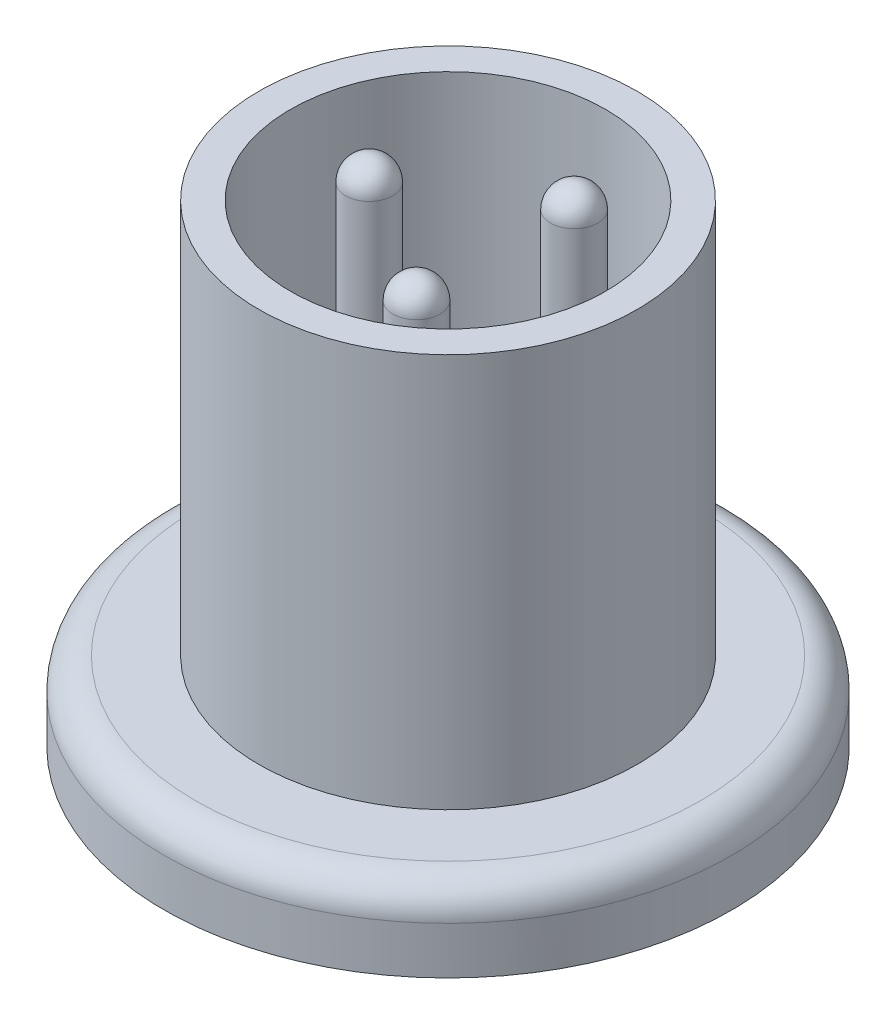
ISO-10303-21;
HEADER;
FILE_DESCRIPTION(('STEP AP214'),'2;1');
FILE_NAME('part.step','',(''),(''),'','','');
FILE_SCHEMA(('AUTOMOTIVE_DESIGN { 1 0 10303 214 1 1 1 1 }'));
ENDSEC;
DATA;
#1=APPLICATION_CONTEXT('core data for automotive mechanical design processes');
#2=APPLICATION_PROTOCOL_DEFINITION('international standard','automotive_design',2000,#1);
#3=PRODUCT_CONTEXT('',#1,'mechanical');
#4=PRODUCT('Part','Part','',(#3));
#5=PRODUCT_RELATED_PRODUCT_CATEGORY('part','',(#4));
#6=PRODUCT_DEFINITION_FORMATION('','',#4);
#7=PRODUCT_DEFINITION_CONTEXT('part definition',#1,'design');
#8=PRODUCT_DEFINITION('design','',#6,#7);
#9=PRODUCT_DEFINITION_SHAPE('','',#8);
#10=(LENGTH_UNIT() NAMED_UNIT(*) SI_UNIT(.MILLI.,.METRE.));
#11=(NAMED_UNIT(*) PLANE_ANGLE_UNIT() SI_UNIT($,.RADIAN.));
#12=(NAMED_UNIT(*) SI_UNIT($,.STERADIAN.) SOLID_ANGLE_UNIT());
#13=UNCERTAINTY_MEASURE_WITH_UNIT(LENGTH_MEASURE(1.E-05),#10,'distance_accuracy_value','');
#14=(GEOMETRIC_REPRESENTATION_CONTEXT(3) GLOBAL_UNCERTAINTY_ASSIGNED_CONTEXT((#13)) GLOBAL_UNIT_ASSIGNED_CONTEXT((#10,
#11,#12)) REPRESENTATION_CONTEXT('',''));
#15=CARTESIAN_POINT('',(0.,0.,0.));
#16=DIRECTION('',(0.,0.,1.));
#17=DIRECTION('',(1.,0.,0.));
#18=AXIS2_PLACEMENT_3D('',#15,#16,#17);
#19=CARTESIAN_POINT('',(5.,3.,0.));
#20=DIRECTION('',(0.,1.,0.));
#21=DIRECTION('',(0.,0.,1.));
#22=AXIS2_PLACEMENT_3D('',#19,#20,#21);
#23=PLANE('',#22);
#24=CARTESIAN_POINT('',(1.5,3.,2.5));
#25=DIRECTION('',(0.,1.,0.));
#26=DIRECTION('',(0.,0.,1.));
#27=AXIS2_PLACEMENT_3D('',#24,#25,#26);
#28=CIRCLE('',#27,0.75);
#29=CARTESIAN_POINT('',(1.5,3.,3.25));
#30=VERTEX_POINT('',#29);
#31=EDGE_CURVE('E72',#30,#30,#28,.T.);
#32=ORIENTED_EDGE('',*,*,#31,.F.);
#33=EDGE_LOOP('',(#32));
#34=FACE_BOUND('',#33,.T.);
#35=CARTESIAN_POINT('',(0.,3.,0.));
#36=DIRECTION('',(0.,-1.,0.));
#37=DIRECTION('',(0.,0.,-1.));
#38=AXIS2_PLACEMENT_3D('',#35,#36,#37);
#39=CIRCLE('',#38,5.);
#40=CARTESIAN_POINT('',(0.,3.,-5.));
#41=VERTEX_POINT('',#40);
#42=EDGE_CURVE('E66',#41,#41,#39,.T.);
#43=ORIENTED_EDGE('',*,*,#42,.F.);
#44=EDGE_LOOP('',(#43));
#45=FACE_BOUND('',#44,.T.);
#46=CARTESIAN_POINT('',(1.5,3.,-2.5));
#47=DIRECTION('',(0.,1.,0.));
#48=DIRECTION('',(0.,0.,1.));
#49=AXIS2_PLACEMENT_3D('',#46,#47,#48);
#50=CIRCLE('',#49,0.75);
#51=CARTESIAN_POINT('',(1.5,3.,-1.75));
#52=VERTEX_POINT('',#51);
#53=EDGE_CURVE('E69',#52,#52,#50,.T.);
#54=ORIENTED_EDGE('',*,*,#53,.F.);
#55=EDGE_LOOP('',(#54));
#56=FACE_BOUND('',#55,.T.);
#57=CARTESIAN_POINT('',(-2.5,3.,0.));
#58=DIRECTION('',(0.,1.,0.));
#59=DIRECTION('',(0.,0.,1.));
#60=AXIS2_PLACEMENT_3D('',#57,#58,#59);
#61=CIRCLE('',#60,0.75);
#62=CARTESIAN_POINT('',(-2.5,3.,0.75));
#63=VERTEX_POINT('',#62);
#64=EDGE_CURVE('E75',#63,#63,#61,.T.);
#65=ORIENTED_EDGE('',*,*,#64,.F.);
#66=EDGE_LOOP('',(#65));
#67=FACE_BOUND('',#66,.T.);
#68=ADVANCED_FACE('F31',(#34,#45,#56,#67),#23,.T.);
#69=CARTESIAN_POINT('',(0.,0.,0.));
#70=DIRECTION('',(0.,-1.,0.));
#71=DIRECTION('',(0.,0.,-1.));
#72=AXIS2_PLACEMENT_3D('',#69,#70,#71);
#73=PLANE('',#72);
#74=CARTESIAN_POINT('',(0.,0.,0.));
#75=DIRECTION('',(0.,-1.,0.));
#76=DIRECTION('',(0.,0.,-1.));
#77=AXIS2_PLACEMENT_3D('',#74,#75,#76);
#78=CIRCLE('',#77,9.);
#79=CARTESIAN_POINT('',(0.,0.,-9.));
#80=VERTEX_POINT('',#79);
#81=EDGE_CURVE('E54',#80,#80,#78,.T.);
#82=ORIENTED_EDGE('',*,*,#81,.T.);
#83=EDGE_LOOP('',(#82));
#84=FACE_BOUND('',#83,.T.);
#85=ADVANCED_FACE('F82',(#84),#73,.T.);
#86=CARTESIAN_POINT('',(0.,0.,0.));
#87=DIRECTION('',(0.,-1.,0.));
#88=DIRECTION('',(0.,0.,-1.));
#89=AXIS2_PLACEMENT_3D('',#86,#87,#88);
#90=CYLINDRICAL_SURFACE('',#89,9.);
#91=CARTESIAN_POINT('',(0.,1.5,0.));
#92=DIRECTION('',(0.,1.,0.));
#93=DIRECTION('',(0.,0.,1.));
#94=AXIS2_PLACEMENT_3D('',#91,#92,#93);
#95=CIRCLE('',#94,9.);
#96=CARTESIAN_POINT('',(0.,1.5,9.));
#97=VERTEX_POINT('',#96);
#98=EDGE_CURVE('E38',#97,#97,#95,.F.);
#99=ORIENTED_EDGE('',*,*,#98,.T.);
#100=EDGE_LOOP('',(#99));
#101=FACE_BOUND('',#100,.T.);
#102=ORIENTED_EDGE('',*,*,#81,.F.);
#103=EDGE_LOOP('',(#102));
#104=FACE_BOUND('',#103,.T.);
#105=ADVANCED_FACE('F88',(#101,#104),#90,.T.);
#106=CARTESIAN_POINT('',(9.,2.5,0.));
#107=DIRECTION('',(0.,1.,0.));
#108=DIRECTION('',(0.,0.,1.));
#109=AXIS2_PLACEMENT_3D('',#106,#107,#108);
#110=PLANE('',#109);
#111=CARTESIAN_POINT('',(0.,2.5,0.));
#112=DIRECTION('',(0.,1.,0.));
#113=DIRECTION('',(0.,0.,1.));
#114=AXIS2_PLACEMENT_3D('',#111,#112,#113);
#115=CIRCLE('',#114,8.);
#116=CARTESIAN_POINT('',(0.,2.5,8.));
#117=VERTEX_POINT('',#116);
#118=EDGE_CURVE('E10',#117,#117,#115,.T.);
#119=ORIENTED_EDGE('',*,*,#118,.T.);
#120=EDGE_LOOP('',(#119));
#121=FACE_BOUND('',#120,.T.);
#122=CARTESIAN_POINT('',(0.,2.5,0.));
#123=DIRECTION('',(0.,-1.,0.));
#124=DIRECTION('',(0.,0.,-1.));
#125=AXIS2_PLACEMENT_3D('',#122,#123,#124);
#126=CIRCLE('',#125,6.);
#127=CARTESIAN_POINT('',(0.,2.5,-6.));
#128=VERTEX_POINT('',#127);
#129=EDGE_CURVE('E57',#128,#128,#126,.T.);
#130=ORIENTED_EDGE('',*,*,#129,.T.);
#131=EDGE_LOOP('',(#130));
#132=FACE_BOUND('',#131,.T.);
#133=ADVANCED_FACE('F108',(#121,#132),#110,.T.);
#134=CARTESIAN_POINT('',(0.,0.,0.));
#135=DIRECTION('',(0.,-1.,0.));
#136=DIRECTION('',(0.,0.,-1.));
#137=AXIS2_PLACEMENT_3D('',#134,#135,#136);
#138=CYLINDRICAL_SURFACE('',#137,6.);
#139=CARTESIAN_POINT('',(0.,15.,0.));
#140=DIRECTION('',(0.,-1.,0.));
#141=DIRECTION('',(0.,0.,-1.));
#142=AXIS2_PLACEMENT_3D('',#139,#140,#141);
#143=CIRCLE('',#142,6.);
#144=CARTESIAN_POINT('',(0.,15.,-6.));
#145=VERTEX_POINT('',#144);
#146=EDGE_CURVE('E60',#145,#145,#143,.T.);
#147=ORIENTED_EDGE('',*,*,#146,.T.);
#148=EDGE_LOOP('',(#147));
#149=FACE_BOUND('',#148,.T.);
#150=ORIENTED_EDGE('',*,*,#129,.F.);
#151=EDGE_LOOP('',(#150));
#152=FACE_BOUND('',#151,.T.);
#153=ADVANCED_FACE('F104',(#149,#152),#138,.T.);
#154=CARTESIAN_POINT('',(6.,15.,0.));
#155=DIRECTION('',(0.,1.,0.));
#156=DIRECTION('',(0.,0.,1.));
#157=AXIS2_PLACEMENT_3D('',#154,#155,#156);
#158=PLANE('',#157);
#159=CARTESIAN_POINT('',(0.,15.,0.));
#160=DIRECTION('',(0.,-1.,0.));
#161=DIRECTION('',(0.,0.,-1.));
#162=AXIS2_PLACEMENT_3D('',#159,#160,#161);
#163=CIRCLE('',#162,5.);
#164=CARTESIAN_POINT('',(0.,15.,-5.));
#165=VERTEX_POINT('',#164);
#166=EDGE_CURVE('E63',#165,#165,#163,.T.);
#167=ORIENTED_EDGE('',*,*,#166,.T.);
#168=EDGE_LOOP('',(#167));
#169=FACE_BOUND('',#168,.T.);
#170=ORIENTED_EDGE('',*,*,#146,.F.);
#171=EDGE_LOOP('',(#170));
#172=FACE_BOUND('',#171,.T.);
#173=ADVANCED_FACE('F100',(#169,#172),#158,.T.);
#174=CARTESIAN_POINT('',(0.,0.,0.));
#175=DIRECTION('',(0.,-1.,0.));
#176=DIRECTION('',(0.,0.,-1.));
#177=AXIS2_PLACEMENT_3D('',#174,#175,#176);
#178=CYLINDRICAL_SURFACE('',#177,5.);
#179=ORIENTED_EDGE('',*,*,#42,.T.);
#180=EDGE_LOOP('',(#179));
#181=FACE_BOUND('',#180,.T.);
#182=ORIENTED_EDGE('',*,*,#166,.F.);
#183=EDGE_LOOP('',(#182));
#184=FACE_BOUND('',#183,.T.);
#185=ADVANCED_FACE('F97',(#181,#184),#178,.F.);
#186=CARTESIAN_POINT('',(1.5,17.1213203435596,-2.5));
#187=DIRECTION('',(0.,-1.,0.));
#188=DIRECTION('',(0.,0.,-1.));
#189=AXIS2_PLACEMENT_3D('',#186,#187,#188);
#190=CYLINDRICAL_SURFACE('',#189,0.75);
#191=CARTESIAN_POINT('',(1.5,14.25,-2.5));
#192=DIRECTION('',(0.,-1.,0.));
#193=DIRECTION('',(0.,0.,-1.));
#194=AXIS2_PLACEMENT_3D('',#191,#192,#193);
#195=CIRCLE('',#194,0.75);
#196=CARTESIAN_POINT('',(1.5,14.25,-3.25));
#197=VERTEX_POINT('',#196);
#198=EDGE_CURVE('E46',#197,#197,#195,.T.);
#199=ORIENTED_EDGE('',*,*,#198,.T.);
#200=EDGE_LOOP('',(#199));
#201=FACE_BOUND('',#200,.T.);
#202=ORIENTED_EDGE('',*,*,#53,.T.);
#203=EDGE_LOOP('',(#202));
#204=FACE_BOUND('',#203,.T.);
#205=ADVANCED_FACE('F95',(#201,#204),#190,.T.);
#206=CARTESIAN_POINT('',(1.5,17.1213203435596,2.5));
#207=DIRECTION('',(0.,-1.,0.));
#208=DIRECTION('',(0.,0.,-1.));
#209=AXIS2_PLACEMENT_3D('',#206,#207,#208);
#210=CYLINDRICAL_SURFACE('',#209,0.75);
#211=CARTESIAN_POINT('',(1.5,14.25,2.5));
#212=DIRECTION('',(0.,-1.,0.));
#213=DIRECTION('',(0.,0.,-1.));
#214=AXIS2_PLACEMENT_3D('',#211,#212,#213);
#215=CIRCLE('',#214,0.75);
#216=CARTESIAN_POINT('',(1.5,14.25,1.75));
#217=VERTEX_POINT('',#216);
#218=EDGE_CURVE('E51',#217,#217,#215,.T.);
#219=ORIENTED_EDGE('',*,*,#218,.T.);
#220=EDGE_LOOP('',(#219));
#221=FACE_BOUND('',#220,.T.);
#222=ORIENTED_EDGE('',*,*,#31,.T.);
#223=EDGE_LOOP('',(#222));
#224=FACE_BOUND('',#223,.T.);
#225=ADVANCED_FACE('F131',(#221,#224),#210,.T.);
#226=CARTESIAN_POINT('',(-2.5,17.1213203435596,0.));
#227=DIRECTION('',(0.,-1.,0.));
#228=DIRECTION('',(0.,0.,-1.));
#229=AXIS2_PLACEMENT_3D('',#226,#227,#228);
#230=CYLINDRICAL_SURFACE('',#229,0.75);
#231=CARTESIAN_POINT('',(-2.5,14.25,0.));
#232=DIRECTION('',(0.,-1.,0.));
#233=DIRECTION('',(0.,0.,-1.));
#234=AXIS2_PLACEMENT_3D('',#231,#232,#233);
#235=CIRCLE('',#234,0.75);
#236=CARTESIAN_POINT('',(-2.5,14.25,-0.75));
#237=VERTEX_POINT('',#236);
#238=EDGE_CURVE('E42',#237,#237,#235,.T.);
#239=ORIENTED_EDGE('',*,*,#238,.T.);
#240=EDGE_LOOP('',(#239));
#241=FACE_BOUND('',#240,.T.);
#242=ORIENTED_EDGE('',*,*,#64,.T.);
#243=EDGE_LOOP('',(#242));
#244=FACE_BOUND('',#243,.T.);
#245=ADVANCED_FACE('F79',(#241,#244),#230,.T.);
#246=CARTESIAN_POINT('',(1.5,14.25,2.5));
#247=DIRECTION('',(0.,0.,1.));
#248=DIRECTION('',(1.,0.,0.));
#249=AXIS2_PLACEMENT_3D('',#246,#247,#248);
#250=SPHERICAL_SURFACE('',#249,0.75);
#251=CARTESIAN_POINT('',(1.5,14.25,2.5));
#252=DIRECTION('',(0.,-1.,0.));
#253=DIRECTION('',(0.,0.,-1.));
#254=AXIS2_PLACEMENT_3D('',#251,#252,#253);
#255=SPHERICAL_SURFACE('',#254,0.75);
#256=ORIENTED_EDGE('',*,*,#218,.F.);
#257=EDGE_LOOP('',(#256));
#258=FACE_BOUND('',#257,.T.);
#259=ADVANCED_FACE('F114',(#258),#255,.T.);
#260=CARTESIAN_POINT('',(1.5,14.25,-2.5));
#261=DIRECTION('',(0.,0.,1.));
#262=DIRECTION('',(1.,0.,0.));
#263=AXIS2_PLACEMENT_3D('',#260,#261,#262);
#264=SPHERICAL_SURFACE('',#263,0.75);
#265=CARTESIAN_POINT('',(1.5,14.25,-2.5));
#266=DIRECTION('',(0.,-1.,0.));
#267=DIRECTION('',(0.,0.,-1.));
#268=AXIS2_PLACEMENT_3D('',#265,#266,#267);
#269=SPHERICAL_SURFACE('',#268,0.75);
#270=ORIENTED_EDGE('',*,*,#198,.F.);
#271=EDGE_LOOP('',(#270));
#272=FACE_BOUND('',#271,.T.);
#273=ADVANCED_FACE('F117',(#272),#269,.T.);
#274=CARTESIAN_POINT('',(-2.5,14.25,0.));
#275=DIRECTION('',(0.,0.,1.));
#276=DIRECTION('',(1.,0.,0.));
#277=AXIS2_PLACEMENT_3D('',#274,#275,#276);
#278=SPHERICAL_SURFACE('',#277,0.75);
#279=CARTESIAN_POINT('',(-2.5,14.25,0.));
#280=DIRECTION('',(0.,-1.,0.));
#281=DIRECTION('',(0.,0.,-1.));
#282=AXIS2_PLACEMENT_3D('',#279,#280,#281);
#283=SPHERICAL_SURFACE('',#282,0.75);
#284=ORIENTED_EDGE('',*,*,#238,.F.);
#285=EDGE_LOOP('',(#284));
#286=FACE_BOUND('',#285,.T.);
#287=ADVANCED_FACE('F120',(#286),#283,.T.);
#288=CARTESIAN_POINT('',(0.,1.5,0.));
#289=DIRECTION('',(0.,1.,0.));
#290=DIRECTION('',(0.,0.,1.));
#291=AXIS2_PLACEMENT_3D('',#288,#289,#290);
#292=TOROIDAL_SURFACE('',#291,8.,1.);
#293=ORIENTED_EDGE('',*,*,#118,.F.);
#294=EDGE_LOOP('',(#293));
#295=FACE_BOUND('',#294,.T.);
#296=ORIENTED_EDGE('',*,*,#98,.F.);
#297=EDGE_LOOP('',(#296));
#298=FACE_BOUND('',#297,.T.);
#299=ADVANCED_FACE('F33',(#295,#298),#292,.T.);
#300=CLOSED_SHELL('',(#68,#85,#105,#133,#153,#173,#185,#205,#225,#245,#259,#273,#287,#299));
#301=MANIFOLD_SOLID_BREP('B2',#300);
#302=ADVANCED_BREP_SHAPE_REPRESENTATION('',(#18,#301),#14);
#303=SHAPE_DEFINITION_REPRESENTATION(#9,#302);
ENDSEC;
END-ISO-10303-21;
